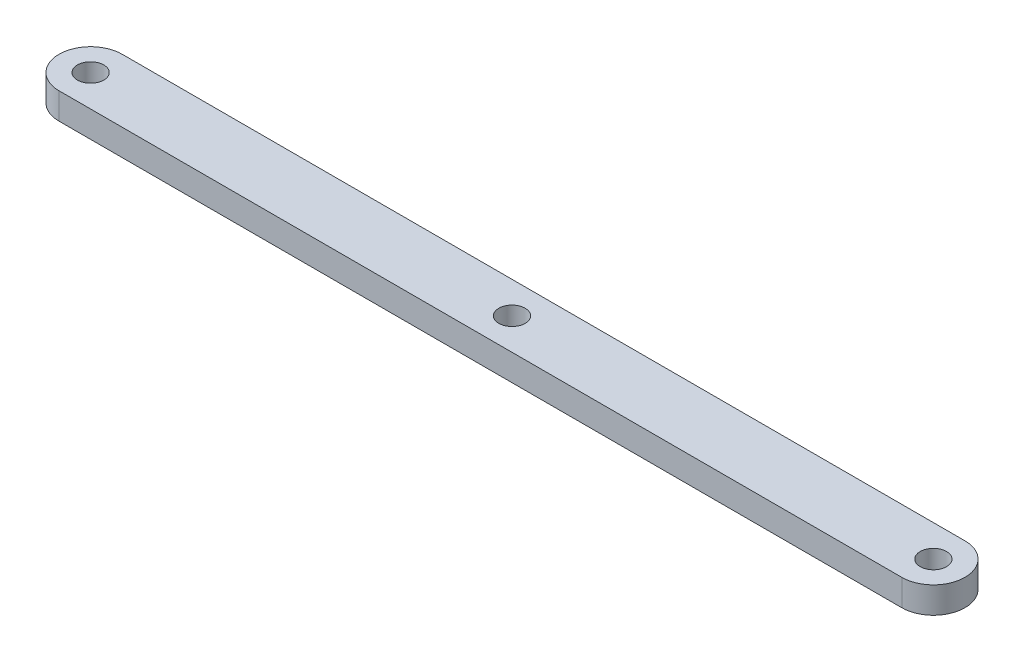
ISO-10303-21;
HEADER;
FILE_DESCRIPTION(('STEP AP214'),'2;1');
FILE_NAME('part.step','',(''),(''),'','','');
FILE_SCHEMA(('AUTOMOTIVE_DESIGN { 1 0 10303 214 1 1 1 1 }'));
ENDSEC;
DATA;
#1=APPLICATION_CONTEXT('core data for automotive mechanical design processes');
#2=APPLICATION_PROTOCOL_DEFINITION('international standard','automotive_design',2000,#1);
#3=PRODUCT_CONTEXT('',#1,'mechanical');
#4=PRODUCT('Part','Part','',(#3));
#5=PRODUCT_RELATED_PRODUCT_CATEGORY('part','',(#4));
#6=PRODUCT_DEFINITION_FORMATION('','',#4);
#7=PRODUCT_DEFINITION_CONTEXT('part definition',#1,'design');
#8=PRODUCT_DEFINITION('design','',#6,#7);
#9=PRODUCT_DEFINITION_SHAPE('','',#8);
#10=(LENGTH_UNIT() NAMED_UNIT(*) SI_UNIT(.MILLI.,.METRE.));
#11=(NAMED_UNIT(*) PLANE_ANGLE_UNIT() SI_UNIT($,.RADIAN.));
#12=(NAMED_UNIT(*) SI_UNIT($,.STERADIAN.) SOLID_ANGLE_UNIT());
#13=UNCERTAINTY_MEASURE_WITH_UNIT(LENGTH_MEASURE(1.E-05),#10,'distance_accuracy_value','');
#14=(GEOMETRIC_REPRESENTATION_CONTEXT(3) GLOBAL_UNCERTAINTY_ASSIGNED_CONTEXT((#13)) GLOBAL_UNIT_ASSIGNED_CONTEXT((#10,
#11,#12)) REPRESENTATION_CONTEXT('',''));
#15=CARTESIAN_POINT('',(0.,0.,0.));
#16=DIRECTION('',(0.,0.,1.));
#17=DIRECTION('',(1.,0.,0.));
#18=AXIS2_PLACEMENT_3D('',#15,#16,#17);
#19=CARTESIAN_POINT('',(-50.8,3.175,0.));
#20=DIRECTION('',(0.,-1.,0.));
#21=DIRECTION('',(0.,0.,-1.));
#22=AXIS2_PLACEMENT_3D('',#19,#20,#21);
#23=CYLINDRICAL_SURFACE('',#22,3.81);
#24=CARTESIAN_POINT('',(-50.8,0.,0.));
#25=DIRECTION('',(0.,1.,0.));
#26=DIRECTION('',(0.,0.,1.));
#27=AXIS2_PLACEMENT_3D('',#24,#25,#26);
#28=CIRCLE('',#27,3.81);
#29=CARTESIAN_POINT('',(-50.8,0.,-3.81));
#30=VERTEX_POINT('',#29);
#31=CARTESIAN_POINT('',(-50.8,0.,3.81));
#32=VERTEX_POINT('',#31);
#33=EDGE_CURVE('E96',#30,#32,#28,.T.);
#34=ORIENTED_EDGE('',*,*,#33,.T.);
#35=DIRECTION('',(0.,-1.,0.));
#36=VECTOR('',#35,1.);
#37=CARTESIAN_POINT('',(-50.8,3.175,3.81));
#38=LINE('',#37,#36);
#39=CARTESIAN_POINT('',(-50.8,3.175,3.81));
#40=VERTEX_POINT('',#39);
#41=EDGE_CURVE('E11',#40,#32,#38,.T.);
#42=ORIENTED_EDGE('',*,*,#41,.F.);
#43=CARTESIAN_POINT('',(-50.8,3.175,0.));
#44=DIRECTION('',(0.,1.,0.));
#45=DIRECTION('',(0.,0.,1.));
#46=AXIS2_PLACEMENT_3D('',#43,#44,#45);
#47=CIRCLE('',#46,3.81);
#48=CARTESIAN_POINT('',(-50.8,3.175,-3.81));
#49=VERTEX_POINT('',#48);
#50=EDGE_CURVE('E84',#49,#40,#47,.T.);
#51=ORIENTED_EDGE('',*,*,#50,.F.);
#52=DIRECTION('',(0.,-1.,0.));
#53=VECTOR('',#52,1.);
#54=CARTESIAN_POINT('',(-50.8,3.175,-3.81));
#55=LINE('',#54,#53);
#56=EDGE_CURVE('E92',#49,#30,#55,.T.);
#57=ORIENTED_EDGE('',*,*,#56,.T.);
#58=EDGE_LOOP('',(#34,#42,#51,#57));
#59=FACE_BOUND('',#58,.T.);
#60=ADVANCED_FACE('F33',(#59),#23,.T.);
#61=CARTESIAN_POINT('',(-50.8,3.175,3.81));
#62=DIRECTION('',(0.,0.,-1.));
#63=DIRECTION('',(-1.,0.,0.));
#64=AXIS2_PLACEMENT_3D('',#61,#62,#63);
#65=PLANE('',#64);
#66=DIRECTION('',(1.,0.,0.));
#67=VECTOR('',#66,1.);
#68=CARTESIAN_POINT('',(-50.8,0.,3.81));
#69=LINE('',#68,#67);
#70=CARTESIAN_POINT('',(50.8,0.,3.81));
#71=VERTEX_POINT('',#70);
#72=EDGE_CURVE('E88',#32,#71,#69,.T.);
#73=ORIENTED_EDGE('',*,*,#72,.T.);
#74=DIRECTION('',(0.,-1.,0.));
#75=VECTOR('',#74,1.);
#76=CARTESIAN_POINT('',(50.8,3.175,3.81));
#77=LINE('',#76,#75);
#78=CARTESIAN_POINT('',(50.8,3.175,3.81));
#79=VERTEX_POINT('',#78);
#80=EDGE_CURVE('E41',#79,#71,#77,.T.);
#81=ORIENTED_EDGE('',*,*,#80,.F.);
#82=DIRECTION('',(1.,0.,0.));
#83=VECTOR('',#82,1.);
#84=CARTESIAN_POINT('',(-50.8,3.175,3.81));
#85=LINE('',#84,#83);
#86=EDGE_CURVE('E79',#40,#79,#85,.T.);
#87=ORIENTED_EDGE('',*,*,#86,.F.);
#88=ORIENTED_EDGE('',*,*,#41,.T.);
#89=EDGE_LOOP('',(#73,#81,#87,#88));
#90=FACE_BOUND('',#89,.T.);
#91=ADVANCED_FACE('F87',(#90),#65,.F.);
#92=CARTESIAN_POINT('',(50.8,3.175,0.));
#93=DIRECTION('',(0.,-1.,0.));
#94=DIRECTION('',(0.,0.,-1.));
#95=AXIS2_PLACEMENT_3D('',#92,#93,#94);
#96=CYLINDRICAL_SURFACE('',#95,3.81);
#97=CARTESIAN_POINT('',(50.8,0.,0.));
#98=DIRECTION('',(0.,1.,0.));
#99=DIRECTION('',(0.,0.,1.));
#100=AXIS2_PLACEMENT_3D('',#97,#98,#99);
#101=CIRCLE('',#100,3.81);
#102=CARTESIAN_POINT('',(50.8,0.,-3.81));
#103=VERTEX_POINT('',#102);
#104=EDGE_CURVE('E66',#71,#103,#101,.T.);
#105=ORIENTED_EDGE('',*,*,#104,.T.);
#106=DIRECTION('',(0.,-1.,0.));
#107=VECTOR('',#106,1.);
#108=CARTESIAN_POINT('',(50.8,3.175,-3.81));
#109=LINE('',#108,#107);
#110=CARTESIAN_POINT('',(50.8,3.175,-3.81));
#111=VERTEX_POINT('',#110);
#112=EDGE_CURVE('E89',#111,#103,#109,.T.);
#113=ORIENTED_EDGE('',*,*,#112,.F.);
#114=CARTESIAN_POINT('',(50.8,3.175,0.));
#115=DIRECTION('',(0.,1.,0.));
#116=DIRECTION('',(0.,0.,1.));
#117=AXIS2_PLACEMENT_3D('',#114,#115,#116);
#118=CIRCLE('',#117,3.81);
#119=EDGE_CURVE('E82',#79,#111,#118,.T.);
#120=ORIENTED_EDGE('',*,*,#119,.F.);
#121=ORIENTED_EDGE('',*,*,#80,.T.);
#122=EDGE_LOOP('',(#105,#113,#120,#121));
#123=FACE_BOUND('',#122,.T.);
#124=ADVANCED_FACE('F90',(#123),#96,.T.);
#125=CARTESIAN_POINT('',(-50.8,3.175,-3.81));
#126=DIRECTION('',(0.,0.,1.));
#127=DIRECTION('',(1.,0.,0.));
#128=AXIS2_PLACEMENT_3D('',#125,#126,#127);
#129=PLANE('',#128);
#130=DIRECTION('',(-1.,0.,0.));
#131=VECTOR('',#130,1.);
#132=CARTESIAN_POINT('',(-50.8,0.,-3.81));
#133=LINE('',#132,#131);
#134=EDGE_CURVE('E72',#103,#30,#133,.T.);
#135=ORIENTED_EDGE('',*,*,#134,.T.);
#136=ORIENTED_EDGE('',*,*,#56,.F.);
#137=DIRECTION('',(-1.,0.,0.));
#138=VECTOR('',#137,1.);
#139=CARTESIAN_POINT('',(-50.8,3.175,-3.81));
#140=LINE('',#139,#138);
#141=EDGE_CURVE('E49',#111,#49,#140,.T.);
#142=ORIENTED_EDGE('',*,*,#141,.F.);
#143=ORIENTED_EDGE('',*,*,#112,.T.);
#144=EDGE_LOOP('',(#135,#136,#142,#143));
#145=FACE_BOUND('',#144,.T.);
#146=ADVANCED_FACE('F104',(#145),#129,.F.);
#147=CARTESIAN_POINT('',(-50.8,3.175,0.));
#148=DIRECTION('',(0.,1.,0.));
#149=DIRECTION('',(0.,0.,1.));
#150=AXIS2_PLACEMENT_3D('',#147,#148,#149);
#151=PLANE('',#150);
#152=CARTESIAN_POINT('',(-50.8,3.175,0.));
#153=DIRECTION('',(0.,1.,0.));
#154=DIRECTION('',(0.,0.,1.));
#155=AXIS2_PLACEMENT_3D('',#152,#153,#154);
#156=CIRCLE('',#155,1.5875);
#157=CARTESIAN_POINT('',(-50.8,3.175,1.5875));
#158=VERTEX_POINT('',#157);
#159=EDGE_CURVE('E122',#158,#158,#156,.T.);
#160=ORIENTED_EDGE('',*,*,#159,.F.);
#161=EDGE_LOOP('',(#160));
#162=FACE_BOUND('',#161,.T.);
#163=CARTESIAN_POINT('',(0.,3.175,0.));
#164=DIRECTION('',(0.,1.,0.));
#165=DIRECTION('',(0.,0.,1.));
#166=AXIS2_PLACEMENT_3D('',#163,#164,#165);
#167=CIRCLE('',#166,1.5875);
#168=CARTESIAN_POINT('',(0.,3.175,1.5875));
#169=VERTEX_POINT('',#168);
#170=EDGE_CURVE('E116',#169,#169,#167,.T.);
#171=ORIENTED_EDGE('',*,*,#170,.F.);
#172=EDGE_LOOP('',(#171));
#173=FACE_BOUND('',#172,.T.);
#174=CARTESIAN_POINT('',(50.8,3.175,0.));
#175=DIRECTION('',(0.,1.,0.));
#176=DIRECTION('',(0.,0.,1.));
#177=AXIS2_PLACEMENT_3D('',#174,#175,#176);
#178=CIRCLE('',#177,1.5875);
#179=CARTESIAN_POINT('',(50.8,3.175,1.5875));
#180=VERTEX_POINT('',#179);
#181=EDGE_CURVE('E110',#180,#180,#178,.T.);
#182=ORIENTED_EDGE('',*,*,#181,.F.);
#183=EDGE_LOOP('',(#182));
#184=FACE_BOUND('',#183,.T.);
#185=ORIENTED_EDGE('',*,*,#50,.T.);
#186=ORIENTED_EDGE('',*,*,#86,.T.);
#187=ORIENTED_EDGE('',*,*,#119,.T.);
#188=ORIENTED_EDGE('',*,*,#141,.T.);
#189=EDGE_LOOP('',(#185,#186,#187,#188));
#190=FACE_BOUND('',#189,.T.);
#191=ADVANCED_FACE('F80',(#162,#173,#184,#190),#151,.T.);
#192=CARTESIAN_POINT('',(-50.8,0.,0.));
#193=DIRECTION('',(0.,1.,0.));
#194=DIRECTION('',(0.,0.,1.));
#195=AXIS2_PLACEMENT_3D('',#192,#193,#194);
#196=PLANE('',#195);
#197=CARTESIAN_POINT('',(-50.8,0.,0.));
#198=DIRECTION('',(0.,1.,0.));
#199=DIRECTION('',(0.,0.,1.));
#200=AXIS2_PLACEMENT_3D('',#197,#198,#199);
#201=CIRCLE('',#200,1.5875);
#202=CARTESIAN_POINT('',(-50.8,0.,1.5875));
#203=VERTEX_POINT('',#202);
#204=EDGE_CURVE('E99',#203,#203,#201,.T.);
#205=ORIENTED_EDGE('',*,*,#204,.T.);
#206=EDGE_LOOP('',(#205));
#207=FACE_BOUND('',#206,.T.);
#208=CARTESIAN_POINT('',(0.,0.,0.));
#209=DIRECTION('',(0.,1.,0.));
#210=DIRECTION('',(0.,0.,1.));
#211=AXIS2_PLACEMENT_3D('',#208,#209,#210);
#212=CIRCLE('',#211,1.5875);
#213=CARTESIAN_POINT('',(0.,0.,1.5875));
#214=VERTEX_POINT('',#213);
#215=EDGE_CURVE('E119',#214,#214,#212,.T.);
#216=ORIENTED_EDGE('',*,*,#215,.T.);
#217=EDGE_LOOP('',(#216));
#218=FACE_BOUND('',#217,.T.);
#219=CARTESIAN_POINT('',(50.8,0.,0.));
#220=DIRECTION('',(0.,1.,0.));
#221=DIRECTION('',(0.,0.,1.));
#222=AXIS2_PLACEMENT_3D('',#219,#220,#221);
#223=CIRCLE('',#222,1.5875);
#224=CARTESIAN_POINT('',(50.8,0.,1.5875));
#225=VERTEX_POINT('',#224);
#226=EDGE_CURVE('E113',#225,#225,#223,.T.);
#227=ORIENTED_EDGE('',*,*,#226,.T.);
#228=EDGE_LOOP('',(#227));
#229=FACE_BOUND('',#228,.T.);
#230=ORIENTED_EDGE('',*,*,#33,.F.);
#231=ORIENTED_EDGE('',*,*,#134,.F.);
#232=ORIENTED_EDGE('',*,*,#104,.F.);
#233=ORIENTED_EDGE('',*,*,#72,.F.);
#234=EDGE_LOOP('',(#230,#231,#232,#233));
#235=FACE_BOUND('',#234,.T.);
#236=ADVANCED_FACE('F107',(#207,#218,#229,#235),#196,.F.);
#237=CARTESIAN_POINT('',(50.8,0.,0.));
#238=DIRECTION('',(0.,1.,0.));
#239=DIRECTION('',(0.,0.,1.));
#240=AXIS2_PLACEMENT_3D('',#237,#238,#239);
#241=CYLINDRICAL_SURFACE('',#240,1.5875);
#242=ORIENTED_EDGE('',*,*,#226,.F.);
#243=EDGE_LOOP('',(#242));
#244=FACE_BOUND('',#243,.T.);
#245=ORIENTED_EDGE('',*,*,#181,.T.);
#246=EDGE_LOOP('',(#245));
#247=FACE_BOUND('',#246,.T.);
#248=ADVANCED_FACE('F144',(#244,#247),#241,.F.);
#249=CARTESIAN_POINT('',(0.,0.,0.));
#250=DIRECTION('',(0.,1.,0.));
#251=DIRECTION('',(0.,0.,1.));
#252=AXIS2_PLACEMENT_3D('',#249,#250,#251);
#253=CYLINDRICAL_SURFACE('',#252,1.5875);
#254=ORIENTED_EDGE('',*,*,#215,.F.);
#255=EDGE_LOOP('',(#254));
#256=FACE_BOUND('',#255,.T.);
#257=ORIENTED_EDGE('',*,*,#170,.T.);
#258=EDGE_LOOP('',(#257));
#259=FACE_BOUND('',#258,.T.);
#260=ADVANCED_FACE('F133',(#256,#259),#253,.F.);
#261=CARTESIAN_POINT('',(-50.8,0.,0.));
#262=DIRECTION('',(0.,1.,0.));
#263=DIRECTION('',(0.,0.,1.));
#264=AXIS2_PLACEMENT_3D('',#261,#262,#263);
#265=CYLINDRICAL_SURFACE('',#264,1.5875);
#266=ORIENTED_EDGE('',*,*,#204,.F.);
#267=EDGE_LOOP('',(#266));
#268=FACE_BOUND('',#267,.T.);
#269=ORIENTED_EDGE('',*,*,#159,.T.);
#270=EDGE_LOOP('',(#269));
#271=FACE_BOUND('',#270,.T.);
#272=ADVANCED_FACE('F130',(#268,#271),#265,.F.);
#273=CLOSED_SHELL('',(#60,#91,#124,#146,#191,#236,#248,#260,#272));
#274=MANIFOLD_SOLID_BREP('B2',#273);
#275=ADVANCED_BREP_SHAPE_REPRESENTATION('',(#18,#274),#14);
#276=SHAPE_DEFINITION_REPRESENTATION(#9,#275);
ENDSEC;
END-ISO-10303-21;
